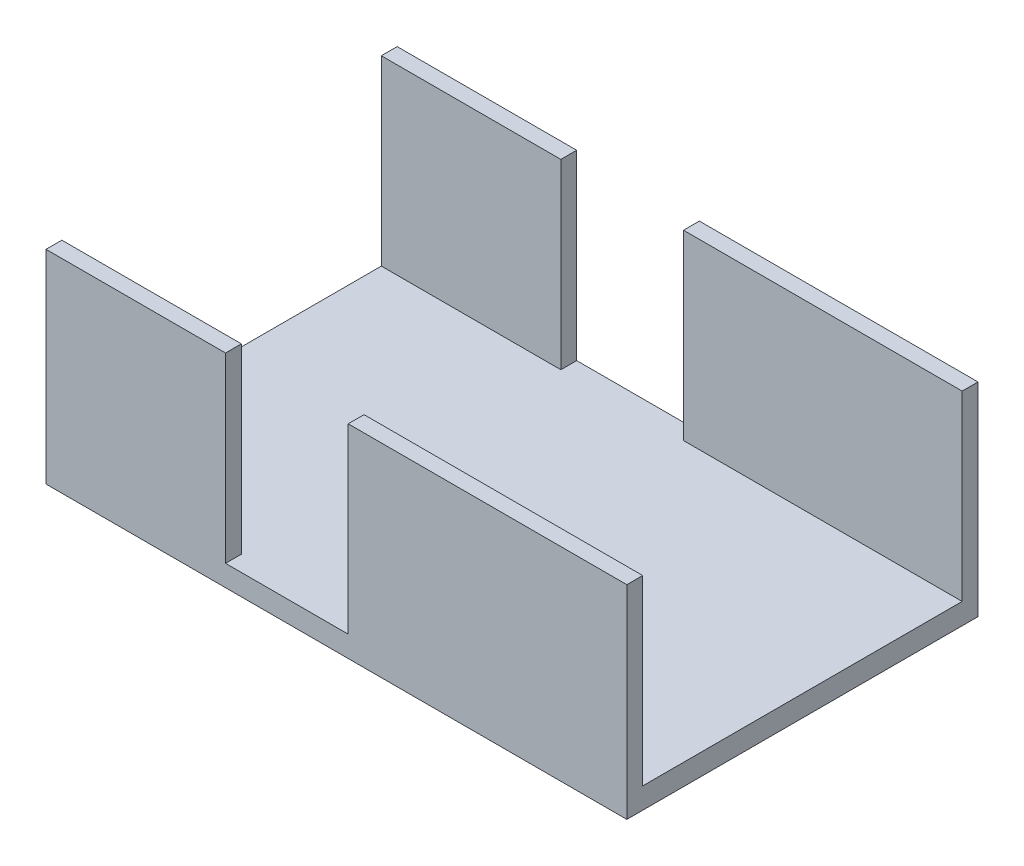
ISO-10303-21;
HEADER;
FILE_DESCRIPTION(('STEP AP214'),'2;1');
FILE_NAME('part.step','',(''),(''),'','','');
FILE_SCHEMA(('AUTOMOTIVE_DESIGN { 1 0 10303 214 1 1 1 1 }'));
ENDSEC;
DATA;
#1=APPLICATION_CONTEXT('core data for automotive mechanical design processes');
#2=APPLICATION_PROTOCOL_DEFINITION('international standard','automotive_design',2000,#1);
#3=PRODUCT_CONTEXT('',#1,'mechanical');
#4=PRODUCT('Part','Part','',(#3));
#5=PRODUCT_RELATED_PRODUCT_CATEGORY('part','',(#4));
#6=PRODUCT_DEFINITION_FORMATION('','',#4);
#7=PRODUCT_DEFINITION_CONTEXT('part definition',#1,'design');
#8=PRODUCT_DEFINITION('design','',#6,#7);
#9=PRODUCT_DEFINITION_SHAPE('','',#8);
#10=(LENGTH_UNIT() NAMED_UNIT(*) SI_UNIT(.MILLI.,.METRE.));
#11=(NAMED_UNIT(*) PLANE_ANGLE_UNIT() SI_UNIT($,.RADIAN.));
#12=(NAMED_UNIT(*) SI_UNIT($,.STERADIAN.) SOLID_ANGLE_UNIT());
#13=UNCERTAINTY_MEASURE_WITH_UNIT(LENGTH_MEASURE(1.E-05),#10,'distance_accuracy_value','');
#14=(GEOMETRIC_REPRESENTATION_CONTEXT(3) GLOBAL_UNCERTAINTY_ASSIGNED_CONTEXT((#13)) GLOBAL_UNIT_ASSIGNED_CONTEXT((#10,
#11,#12)) REPRESENTATION_CONTEXT('',''));
#15=CARTESIAN_POINT('',(0.,0.,0.));
#16=DIRECTION('',(0.,0.,1.));
#17=DIRECTION('',(1.,0.,0.));
#18=AXIS2_PLACEMENT_3D('',#15,#16,#17);
#19=CARTESIAN_POINT('',(110.,4.,0.));
#20=DIRECTION('',(-1.,0.,0.));
#21=DIRECTION('',(0.,0.,1.));
#22=AXIS2_PLACEMENT_3D('',#19,#20,#21);
#23=PLANE('',#22);
#24=DIRECTION('',(0.,0.,-1.));
#25=VECTOR('',#24,1.);
#26=CARTESIAN_POINT('',(110.,0.,0.));
#27=LINE('',#26,#25);
#28=CARTESIAN_POINT('',(110.,0.,0.));
#29=VERTEX_POINT('',#28);
#30=CARTESIAN_POINT('',(110.,0.,-66.5));
#31=VERTEX_POINT('',#30);
#32=EDGE_CURVE('E252',#29,#31,#27,.T.);
#33=ORIENTED_EDGE('',*,*,#32,.T.);
#34=DIRECTION('',(0.,-1.,0.));
#35=VECTOR('',#34,1.);
#36=CARTESIAN_POINT('',(110.,38.5,-66.5));
#37=LINE('',#36,#35);
#38=CARTESIAN_POINT('',(110.,38.5,-66.5));
#39=VERTEX_POINT('',#38);
#40=EDGE_CURVE('E240',#39,#31,#37,.T.);
#41=ORIENTED_EDGE('',*,*,#40,.F.);
#42=DIRECTION('',(0.,0.,-1.));
#43=VECTOR('',#42,1.);
#44=CARTESIAN_POINT('',(110.,38.5,0.));
#45=LINE('',#44,#43);
#46=CARTESIAN_POINT('',(110.,38.5,-63.5));
#47=VERTEX_POINT('',#46);
#48=EDGE_CURVE('E238',#47,#39,#45,.T.);
#49=ORIENTED_EDGE('',*,*,#48,.F.);
#50=DIRECTION('',(0.,-1.,0.));
#51=VECTOR('',#50,1.);
#52=CARTESIAN_POINT('',(110.,38.5,-63.5));
#53=LINE('',#52,#51);
#54=CARTESIAN_POINT('',(110.,4.,-63.5));
#55=VERTEX_POINT('',#54);
#56=EDGE_CURVE('E243',#47,#55,#53,.T.);
#57=ORIENTED_EDGE('',*,*,#56,.T.);
#58=DIRECTION('',(0.,0.,-1.));
#59=VECTOR('',#58,1.);
#60=CARTESIAN_POINT('',(110.,4.,0.));
#61=LINE('',#60,#59);
#62=CARTESIAN_POINT('',(110.,4.,-3.));
#63=VERTEX_POINT('',#62);
#64=EDGE_CURVE('E258',#63,#55,#61,.T.);
#65=ORIENTED_EDGE('',*,*,#64,.F.);
#66=DIRECTION('',(0.,-1.,0.));
#67=VECTOR('',#66,1.);
#68=CARTESIAN_POINT('',(110.,38.5,-3.));
#69=LINE('',#68,#67);
#70=CARTESIAN_POINT('',(110.,38.5,-3.));
#71=VERTEX_POINT('',#70);
#72=EDGE_CURVE('E221',#71,#63,#69,.T.);
#73=ORIENTED_EDGE('',*,*,#72,.F.);
#74=DIRECTION('',(0.,0.,-1.));
#75=VECTOR('',#74,1.);
#76=CARTESIAN_POINT('',(110.,38.5,0.));
#77=LINE('',#76,#75);
#78=CARTESIAN_POINT('',(110.,38.5,0.));
#79=VERTEX_POINT('',#78);
#80=EDGE_CURVE('E219',#79,#71,#77,.T.);
#81=ORIENTED_EDGE('',*,*,#80,.F.);
#82=DIRECTION('',(0.,-1.,0.));
#83=VECTOR('',#82,1.);
#84=CARTESIAN_POINT('',(110.,38.5,0.));
#85=LINE('',#84,#83);
#86=EDGE_CURVE('E223',#79,#29,#85,.T.);
#87=ORIENTED_EDGE('',*,*,#86,.T.);
#88=EDGE_LOOP('',(#33,#41,#49,#57,#65,#73,#81,#87));
#89=FACE_BOUND('',#88,.T.);
#90=ADVANCED_FACE('F41',(#89),#23,.F.);
#91=CARTESIAN_POINT('',(0.,4.,-66.5));
#92=DIRECTION('',(0.,0.,-1.));
#93=DIRECTION('',(-1.,0.,0.));
#94=AXIS2_PLACEMENT_3D('',#91,#92,#93);
#95=PLANE('',#94);
#96=DIRECTION('',(1.,0.,0.));
#97=VECTOR('',#96,1.);
#98=CARTESIAN_POINT('',(0.,0.,-66.5));
#99=LINE('',#98,#97);
#100=CARTESIAN_POINT('',(0.,0.,-66.5));
#101=VERTEX_POINT('',#100);
#102=EDGE_CURVE('E278',#101,#31,#99,.T.);
#103=ORIENTED_EDGE('',*,*,#102,.F.);
#104=DIRECTION('',(0.,-1.,0.));
#105=VECTOR('',#104,1.);
#106=CARTESIAN_POINT('',(0.,38.5,-66.5));
#107=LINE('',#106,#105);
#108=CARTESIAN_POINT('',(0.,38.5,-66.5));
#109=VERTEX_POINT('',#108);
#110=EDGE_CURVE('E185',#109,#101,#107,.T.);
#111=ORIENTED_EDGE('',*,*,#110,.F.);
#112=DIRECTION('',(1.,0.,0.));
#113=VECTOR('',#112,1.);
#114=CARTESIAN_POINT('',(0.,38.5,-66.5));
#115=LINE('',#114,#113);
#116=CARTESIAN_POINT('',(34.,38.5,-66.5));
#117=VERTEX_POINT('',#116);
#118=EDGE_CURVE('E178',#109,#117,#115,.T.);
#119=ORIENTED_EDGE('',*,*,#118,.T.);
#120=DIRECTION('',(0.,-1.,0.));
#121=VECTOR('',#120,1.);
#122=CARTESIAN_POINT('',(34.,38.5,-66.5));
#123=LINE('',#122,#121);
#124=CARTESIAN_POINT('',(34.,4.,-66.5));
#125=VERTEX_POINT('',#124);
#126=EDGE_CURVE('E164',#117,#125,#123,.T.);
#127=ORIENTED_EDGE('',*,*,#126,.T.);
#128=DIRECTION('',(1.,0.,0.));
#129=VECTOR('',#128,1.);
#130=CARTESIAN_POINT('',(0.,4.,-66.5));
#131=LINE('',#130,#129);
#132=CARTESIAN_POINT('',(57.23,4.,-66.5));
#133=VERTEX_POINT('',#132);
#134=EDGE_CURVE('E265',#125,#133,#131,.T.);
#135=ORIENTED_EDGE('',*,*,#134,.T.);
#136=DIRECTION('',(0.,-1.,0.));
#137=VECTOR('',#136,1.);
#138=CARTESIAN_POINT('',(57.23,38.5,-66.5));
#139=LINE('',#138,#137);
#140=CARTESIAN_POINT('',(57.23,38.5,-66.5));
#141=VERTEX_POINT('',#140);
#142=EDGE_CURVE('E249',#141,#133,#139,.T.);
#143=ORIENTED_EDGE('',*,*,#142,.F.);
#144=DIRECTION('',(1.,0.,0.));
#145=VECTOR('',#144,1.);
#146=CARTESIAN_POINT('',(0.,38.5,-66.5));
#147=LINE('',#146,#145);
#148=EDGE_CURVE('E163',#141,#39,#147,.T.);
#149=ORIENTED_EDGE('',*,*,#148,.T.);
#150=ORIENTED_EDGE('',*,*,#40,.T.);
#151=EDGE_LOOP('',(#103,#111,#119,#127,#135,#143,#149,#150));
#152=FACE_BOUND('',#151,.T.);
#153=ADVANCED_FACE('F319',(#152),#95,.T.);
#154=CARTESIAN_POINT('',(0.,4.,0.));
#155=DIRECTION('',(-1.,0.,0.));
#156=DIRECTION('',(0.,0.,1.));
#157=AXIS2_PLACEMENT_3D('',#154,#155,#156);
#158=PLANE('',#157);
#159=DIRECTION('',(0.,0.,-1.));
#160=VECTOR('',#159,1.);
#161=CARTESIAN_POINT('',(0.,0.,0.));
#162=LINE('',#161,#160);
#163=CARTESIAN_POINT('',(0.,0.,0.));
#164=VERTEX_POINT('',#163);
#165=EDGE_CURVE('E279',#164,#101,#162,.T.);
#166=ORIENTED_EDGE('',*,*,#165,.F.);
#167=DIRECTION('',(0.,-1.,0.));
#168=VECTOR('',#167,1.);
#169=CARTESIAN_POINT('',(0.,38.5,0.));
#170=LINE('',#169,#168);
#171=CARTESIAN_POINT('',(0.,38.5,0.));
#172=VERTEX_POINT('',#171);
#173=EDGE_CURVE('E204',#172,#164,#170,.T.);
#174=ORIENTED_EDGE('',*,*,#173,.F.);
#175=DIRECTION('',(0.,0.,-1.));
#176=VECTOR('',#175,1.);
#177=CARTESIAN_POINT('',(0.,38.5,0.));
#178=LINE('',#177,#176);
#179=CARTESIAN_POINT('',(0.,38.5,-3.));
#180=VERTEX_POINT('',#179);
#181=EDGE_CURVE('E196',#172,#180,#178,.T.);
#182=ORIENTED_EDGE('',*,*,#181,.T.);
#183=DIRECTION('',(0.,-1.,0.));
#184=VECTOR('',#183,1.);
#185=CARTESIAN_POINT('',(0.,38.5,-3.));
#186=LINE('',#185,#184);
#187=CARTESIAN_POINT('',(0.,4.,-3.));
#188=VERTEX_POINT('',#187);
#189=EDGE_CURVE('E207',#180,#188,#186,.T.);
#190=ORIENTED_EDGE('',*,*,#189,.T.);
#191=DIRECTION('',(0.,0.,-1.));
#192=VECTOR('',#191,1.);
#193=CARTESIAN_POINT('',(0.,4.,0.));
#194=LINE('',#193,#192);
#195=CARTESIAN_POINT('',(0.,4.,-63.5));
#196=VERTEX_POINT('',#195);
#197=EDGE_CURVE('E271',#188,#196,#194,.T.);
#198=ORIENTED_EDGE('',*,*,#197,.T.);
#199=DIRECTION('',(0.,-1.,0.));
#200=VECTOR('',#199,1.);
#201=CARTESIAN_POINT('',(0.,38.5,-63.5));
#202=LINE('',#201,#200);
#203=CARTESIAN_POINT('',(0.,38.5,-63.5));
#204=VERTEX_POINT('',#203);
#205=EDGE_CURVE('E183',#204,#196,#202,.T.);
#206=ORIENTED_EDGE('',*,*,#205,.F.);
#207=DIRECTION('',(0.,0.,-1.));
#208=VECTOR('',#207,1.);
#209=CARTESIAN_POINT('',(0.,38.5,0.));
#210=LINE('',#209,#208);
#211=EDGE_CURVE('E173',#204,#109,#210,.T.);
#212=ORIENTED_EDGE('',*,*,#211,.T.);
#213=ORIENTED_EDGE('',*,*,#110,.T.);
#214=EDGE_LOOP('',(#166,#174,#182,#190,#198,#206,#212,#213));
#215=FACE_BOUND('',#214,.T.);
#216=ADVANCED_FACE('F323',(#215),#158,.T.);
#217=CARTESIAN_POINT('',(0.,4.,0.));
#218=DIRECTION('',(0.,0.,-1.));
#219=DIRECTION('',(-1.,0.,0.));
#220=AXIS2_PLACEMENT_3D('',#217,#218,#219);
#221=PLANE('',#220);
#222=DIRECTION('',(1.,0.,0.));
#223=VECTOR('',#222,1.);
#224=CARTESIAN_POINT('',(0.,0.,0.));
#225=LINE('',#224,#223);
#226=EDGE_CURVE('E44',#164,#29,#225,.T.);
#227=ORIENTED_EDGE('',*,*,#226,.T.);
#228=ORIENTED_EDGE('',*,*,#86,.F.);
#229=DIRECTION('',(1.,0.,0.));
#230=VECTOR('',#229,1.);
#231=CARTESIAN_POINT('',(0.,38.5,0.));
#232=LINE('',#231,#230);
#233=CARTESIAN_POINT('',(57.23,38.5,0.));
#234=VERTEX_POINT('',#233);
#235=EDGE_CURVE('E217',#234,#79,#232,.T.);
#236=ORIENTED_EDGE('',*,*,#235,.F.);
#237=DIRECTION('',(0.,-1.,0.));
#238=VECTOR('',#237,1.);
#239=CARTESIAN_POINT('',(57.23,38.5,0.));
#240=LINE('',#239,#238);
#241=CARTESIAN_POINT('',(57.23,4.,0.));
#242=VERTEX_POINT('',#241);
#243=EDGE_CURVE('E226',#234,#242,#240,.T.);
#244=ORIENTED_EDGE('',*,*,#243,.T.);
#245=DIRECTION('',(1.,0.,0.));
#246=VECTOR('',#245,1.);
#247=CARTESIAN_POINT('',(0.,4.,0.));
#248=LINE('',#247,#246);
#249=CARTESIAN_POINT('',(34.,4.,0.));
#250=VERTEX_POINT('',#249);
#251=EDGE_CURVE('E11',#250,#242,#248,.T.);
#252=ORIENTED_EDGE('',*,*,#251,.F.);
#253=DIRECTION('',(0.,-1.,0.));
#254=VECTOR('',#253,1.);
#255=CARTESIAN_POINT('',(34.,38.5,0.));
#256=LINE('',#255,#254);
#257=CARTESIAN_POINT('',(34.,38.5,0.));
#258=VERTEX_POINT('',#257);
#259=EDGE_CURVE('E201',#258,#250,#256,.T.);
#260=ORIENTED_EDGE('',*,*,#259,.F.);
#261=DIRECTION('',(1.,0.,0.));
#262=VECTOR('',#261,1.);
#263=CARTESIAN_POINT('',(0.,38.5,0.));
#264=LINE('',#263,#262);
#265=EDGE_CURVE('E199',#172,#258,#264,.T.);
#266=ORIENTED_EDGE('',*,*,#265,.F.);
#267=ORIENTED_EDGE('',*,*,#173,.T.);
#268=EDGE_LOOP('',(#227,#228,#236,#244,#252,#260,#266,#267));
#269=FACE_BOUND('',#268,.T.);
#270=ADVANCED_FACE('F286',(#269),#221,.F.);
#271=CARTESIAN_POINT('',(0.,4.,0.));
#272=DIRECTION('',(0.,1.,0.));
#273=DIRECTION('',(0.,0.,1.));
#274=AXIS2_PLACEMENT_3D('',#271,#272,#273);
#275=PLANE('',#274);
#276=DIRECTION('',(0.,0.,1.));
#277=VECTOR('',#276,1.);
#278=CARTESIAN_POINT('',(57.23,4.,0.));
#279=LINE('',#278,#277);
#280=CARTESIAN_POINT('',(57.23,4.,-3.));
#281=VERTEX_POINT('',#280);
#282=EDGE_CURVE('E253',#281,#242,#279,.T.);
#283=ORIENTED_EDGE('',*,*,#282,.F.);
#284=DIRECTION('',(1.,0.,0.));
#285=VECTOR('',#284,1.);
#286=CARTESIAN_POINT('',(0.,4.,-3.));
#287=LINE('',#286,#285);
#288=EDGE_CURVE('E255',#281,#63,#287,.T.);
#289=ORIENTED_EDGE('',*,*,#288,.T.);
#290=ORIENTED_EDGE('',*,*,#64,.T.);
#291=DIRECTION('',(-1.,0.,0.));
#292=VECTOR('',#291,1.);
#293=CARTESIAN_POINT('',(0.,4.,-63.5));
#294=LINE('',#293,#292);
#295=CARTESIAN_POINT('',(57.23,4.,-63.5));
#296=VERTEX_POINT('',#295);
#297=EDGE_CURVE('E260',#55,#296,#294,.T.);
#298=ORIENTED_EDGE('',*,*,#297,.T.);
#299=DIRECTION('',(0.,0.,1.));
#300=VECTOR('',#299,1.);
#301=CARTESIAN_POINT('',(57.23,4.,0.));
#302=LINE('',#301,#300);
#303=EDGE_CURVE('E262',#133,#296,#302,.T.);
#304=ORIENTED_EDGE('',*,*,#303,.F.);
#305=ORIENTED_EDGE('',*,*,#134,.F.);
#306=DIRECTION('',(0.,0.,1.));
#307=VECTOR('',#306,1.);
#308=CARTESIAN_POINT('',(34.,4.,0.));
#309=LINE('',#308,#307);
#310=CARTESIAN_POINT('',(34.,4.,-63.5));
#311=VERTEX_POINT('',#310);
#312=EDGE_CURVE('E268',#125,#311,#309,.T.);
#313=ORIENTED_EDGE('',*,*,#312,.T.);
#314=DIRECTION('',(-1.,0.,0.));
#315=VECTOR('',#314,1.);
#316=CARTESIAN_POINT('',(0.,4.,-63.5));
#317=LINE('',#316,#315);
#318=EDGE_CURVE('E159',#311,#196,#317,.T.);
#319=ORIENTED_EDGE('',*,*,#318,.T.);
#320=ORIENTED_EDGE('',*,*,#197,.F.);
#321=DIRECTION('',(1.,0.,0.));
#322=VECTOR('',#321,1.);
#323=CARTESIAN_POINT('',(0.,4.,-3.));
#324=LINE('',#323,#322);
#325=CARTESIAN_POINT('',(34.,4.,-3.));
#326=VERTEX_POINT('',#325);
#327=EDGE_CURVE('E60',#188,#326,#324,.T.);
#328=ORIENTED_EDGE('',*,*,#327,.T.);
#329=DIRECTION('',(0.,0.,1.));
#330=VECTOR('',#329,1.);
#331=CARTESIAN_POINT('',(34.,4.,0.));
#332=LINE('',#331,#330);
#333=EDGE_CURVE('E49',#326,#250,#332,.T.);
#334=ORIENTED_EDGE('',*,*,#333,.T.);
#335=ORIENTED_EDGE('',*,*,#251,.T.);
#336=EDGE_LOOP('',(#283,#289,#290,#298,#304,#305,#313,#319,#320,#328,#334,#335));
#337=FACE_BOUND('',#336,.T.);
#338=ADVANCED_FACE('F302',(#337),#275,.T.);
#339=CARTESIAN_POINT('',(0.,0.,0.));
#340=DIRECTION('',(0.,1.,0.));
#341=DIRECTION('',(0.,0.,1.));
#342=AXIS2_PLACEMENT_3D('',#339,#340,#341);
#343=PLANE('',#342);
#344=ORIENTED_EDGE('',*,*,#32,.F.);
#345=ORIENTED_EDGE('',*,*,#226,.F.);
#346=ORIENTED_EDGE('',*,*,#165,.T.);
#347=ORIENTED_EDGE('',*,*,#102,.T.);
#348=EDGE_LOOP('',(#344,#345,#346,#347));
#349=FACE_BOUND('',#348,.T.);
#350=ADVANCED_FACE('F333',(#349),#343,.F.);
#351=CARTESIAN_POINT('',(57.23,38.5,0.));
#352=DIRECTION('',(1.,0.,0.));
#353=DIRECTION('',(0.,0.,-1.));
#354=AXIS2_PLACEMENT_3D('',#351,#352,#353);
#355=PLANE('',#354);
#356=ORIENTED_EDGE('',*,*,#303,.T.);
#357=DIRECTION('',(0.,-1.,0.));
#358=VECTOR('',#357,1.);
#359=CARTESIAN_POINT('',(57.23,38.5,-63.5));
#360=LINE('',#359,#358);
#361=CARTESIAN_POINT('',(57.23,38.5,-63.5));
#362=VERTEX_POINT('',#361);
#363=EDGE_CURVE('E246',#362,#296,#360,.T.);
#364=ORIENTED_EDGE('',*,*,#363,.F.);
#365=DIRECTION('',(0.,0.,1.));
#366=VECTOR('',#365,1.);
#367=CARTESIAN_POINT('',(57.23,38.5,0.));
#368=LINE('',#367,#366);
#369=EDGE_CURVE('E233',#141,#362,#368,.T.);
#370=ORIENTED_EDGE('',*,*,#369,.F.);
#371=ORIENTED_EDGE('',*,*,#142,.T.);
#372=EDGE_LOOP('',(#356,#364,#370,#371));
#373=FACE_BOUND('',#372,.T.);
#374=ADVANCED_FACE('F336',(#373),#355,.F.);
#375=CARTESIAN_POINT('',(0.,38.5,-63.5));
#376=DIRECTION('',(0.,0.,1.));
#377=DIRECTION('',(1.,0.,0.));
#378=AXIS2_PLACEMENT_3D('',#375,#376,#377);
#379=PLANE('',#378);
#380=ORIENTED_EDGE('',*,*,#363,.T.);
#381=ORIENTED_EDGE('',*,*,#297,.F.);
#382=ORIENTED_EDGE('',*,*,#56,.F.);
#383=DIRECTION('',(-1.,0.,0.));
#384=VECTOR('',#383,1.);
#385=CARTESIAN_POINT('',(0.,38.5,-63.5));
#386=LINE('',#385,#384);
#387=EDGE_CURVE('E235',#47,#362,#386,.T.);
#388=ORIENTED_EDGE('',*,*,#387,.T.);
#389=EDGE_LOOP('',(#380,#381,#382,#388));
#390=FACE_BOUND('',#389,.T.);
#391=ADVANCED_FACE('F341',(#390),#379,.T.);
#392=CARTESIAN_POINT('',(0.,38.5,0.));
#393=DIRECTION('',(0.,1.,0.));
#394=DIRECTION('',(0.,0.,1.));
#395=AXIS2_PLACEMENT_3D('',#392,#393,#394);
#396=PLANE('',#395);
#397=ORIENTED_EDGE('',*,*,#148,.F.);
#398=ORIENTED_EDGE('',*,*,#369,.T.);
#399=ORIENTED_EDGE('',*,*,#387,.F.);
#400=ORIENTED_EDGE('',*,*,#48,.T.);
#401=EDGE_LOOP('',(#397,#398,#399,#400));
#402=FACE_BOUND('',#401,.T.);
#403=ADVANCED_FACE('F344',(#402),#396,.T.);
#404=CARTESIAN_POINT('',(0.,38.5,-63.5));
#405=DIRECTION('',(0.,0.,1.));
#406=DIRECTION('',(1.,0.,0.));
#407=AXIS2_PLACEMENT_3D('',#404,#405,#406);
#408=PLANE('',#407);
#409=ORIENTED_EDGE('',*,*,#205,.T.);
#410=ORIENTED_EDGE('',*,*,#318,.F.);
#411=DIRECTION('',(0.,-1.,0.));
#412=VECTOR('',#411,1.);
#413=CARTESIAN_POINT('',(34.,38.5,-63.5));
#414=LINE('',#413,#412);
#415=CARTESIAN_POINT('',(34.,38.5,-63.5));
#416=VERTEX_POINT('',#415);
#417=EDGE_CURVE('E153',#416,#311,#414,.T.);
#418=ORIENTED_EDGE('',*,*,#417,.F.);
#419=DIRECTION('',(-1.,0.,0.));
#420=VECTOR('',#419,1.);
#421=CARTESIAN_POINT('',(0.,38.5,-63.5));
#422=LINE('',#421,#420);
#423=EDGE_CURVE('E157',#416,#204,#422,.T.);
#424=ORIENTED_EDGE('',*,*,#423,.T.);
#425=EDGE_LOOP('',(#409,#410,#418,#424));
#426=FACE_BOUND('',#425,.T.);
#427=ADVANCED_FACE('F156',(#426),#408,.T.);
#428=CARTESIAN_POINT('',(34.,38.5,0.));
#429=DIRECTION('',(1.,0.,0.));
#430=DIRECTION('',(0.,0.,-1.));
#431=AXIS2_PLACEMENT_3D('',#428,#429,#430);
#432=PLANE('',#431);
#433=ORIENTED_EDGE('',*,*,#417,.T.);
#434=ORIENTED_EDGE('',*,*,#312,.F.);
#435=ORIENTED_EDGE('',*,*,#126,.F.);
#436=DIRECTION('',(0.,0.,1.));
#437=VECTOR('',#436,1.);
#438=CARTESIAN_POINT('',(34.,38.5,0.));
#439=LINE('',#438,#437);
#440=EDGE_CURVE('E170',#117,#416,#439,.T.);
#441=ORIENTED_EDGE('',*,*,#440,.T.);
#442=EDGE_LOOP('',(#433,#434,#435,#441));
#443=FACE_BOUND('',#442,.T.);
#444=ADVANCED_FACE('F176',(#443),#432,.T.);
#445=CARTESIAN_POINT('',(0.,38.5,0.));
#446=DIRECTION('',(0.,1.,0.));
#447=DIRECTION('',(0.,0.,1.));
#448=AXIS2_PLACEMENT_3D('',#445,#446,#447);
#449=PLANE('',#448);
#450=ORIENTED_EDGE('',*,*,#423,.F.);
#451=ORIENTED_EDGE('',*,*,#440,.F.);
#452=ORIENTED_EDGE('',*,*,#118,.F.);
#453=ORIENTED_EDGE('',*,*,#211,.F.);
#454=EDGE_LOOP('',(#450,#451,#452,#453));
#455=FACE_BOUND('',#454,.T.);
#456=ADVANCED_FACE('F168',(#455),#449,.T.);
#457=CARTESIAN_POINT('',(34.,38.5,0.));
#458=DIRECTION('',(1.,0.,0.));
#459=DIRECTION('',(0.,0.,-1.));
#460=AXIS2_PLACEMENT_3D('',#457,#458,#459);
#461=PLANE('',#460);
#462=ORIENTED_EDGE('',*,*,#259,.T.);
#463=ORIENTED_EDGE('',*,*,#333,.F.);
#464=DIRECTION('',(0.,-1.,0.));
#465=VECTOR('',#464,1.);
#466=CARTESIAN_POINT('',(34.,38.5,-3.));
#467=LINE('',#466,#465);
#468=CARTESIAN_POINT('',(34.,38.5,-3.));
#469=VERTEX_POINT('',#468);
#470=EDGE_CURVE('E174',#469,#326,#467,.T.);
#471=ORIENTED_EDGE('',*,*,#470,.F.);
#472=DIRECTION('',(0.,0.,1.));
#473=VECTOR('',#472,1.);
#474=CARTESIAN_POINT('',(34.,38.5,0.));
#475=LINE('',#474,#473);
#476=EDGE_CURVE('E189',#469,#258,#475,.T.);
#477=ORIENTED_EDGE('',*,*,#476,.T.);
#478=EDGE_LOOP('',(#462,#463,#471,#477));
#479=FACE_BOUND('',#478,.T.);
#480=ADVANCED_FACE('F362',(#479),#461,.T.);
#481=CARTESIAN_POINT('',(0.,38.5,-3.));
#482=DIRECTION('',(0.,0.,-1.));
#483=DIRECTION('',(-1.,0.,0.));
#484=AXIS2_PLACEMENT_3D('',#481,#482,#483);
#485=PLANE('',#484);
#486=ORIENTED_EDGE('',*,*,#470,.T.);
#487=ORIENTED_EDGE('',*,*,#327,.F.);
#488=ORIENTED_EDGE('',*,*,#189,.F.);
#489=DIRECTION('',(1.,0.,0.));
#490=VECTOR('',#489,1.);
#491=CARTESIAN_POINT('',(0.,38.5,-3.));
#492=LINE('',#491,#490);
#493=EDGE_CURVE('E192',#180,#469,#492,.T.);
#494=ORIENTED_EDGE('',*,*,#493,.T.);
#495=EDGE_LOOP('',(#486,#487,#488,#494));
#496=FACE_BOUND('',#495,.T.);
#497=ADVANCED_FACE('F314',(#496),#485,.T.);
#498=CARTESIAN_POINT('',(0.,38.5,0.));
#499=DIRECTION('',(0.,1.,0.));
#500=DIRECTION('',(0.,0.,1.));
#501=AXIS2_PLACEMENT_3D('',#498,#499,#500);
#502=PLANE('',#501);
#503=ORIENTED_EDGE('',*,*,#476,.F.);
#504=ORIENTED_EDGE('',*,*,#493,.F.);
#505=ORIENTED_EDGE('',*,*,#181,.F.);
#506=ORIENTED_EDGE('',*,*,#265,.T.);
#507=EDGE_LOOP('',(#503,#504,#505,#506));
#508=FACE_BOUND('',#507,.T.);
#509=ADVANCED_FACE('F307',(#508),#502,.T.);
#510=CARTESIAN_POINT('',(0.,38.5,-3.));
#511=DIRECTION('',(0.,0.,-1.));
#512=DIRECTION('',(-1.,0.,0.));
#513=AXIS2_PLACEMENT_3D('',#510,#511,#512);
#514=PLANE('',#513);
#515=ORIENTED_EDGE('',*,*,#72,.T.);
#516=ORIENTED_EDGE('',*,*,#288,.F.);
#517=DIRECTION('',(0.,-1.,0.));
#518=VECTOR('',#517,1.);
#519=CARTESIAN_POINT('',(57.23,38.5,-3.));
#520=LINE('',#519,#518);
#521=CARTESIAN_POINT('',(57.23,38.5,-3.));
#522=VERTEX_POINT('',#521);
#523=EDGE_CURVE('E193',#522,#281,#520,.T.);
#524=ORIENTED_EDGE('',*,*,#523,.F.);
#525=DIRECTION('',(1.,0.,0.));
#526=VECTOR('',#525,1.);
#527=CARTESIAN_POINT('',(0.,38.5,-3.));
#528=LINE('',#527,#526);
#529=EDGE_CURVE('E212',#522,#71,#528,.T.);
#530=ORIENTED_EDGE('',*,*,#529,.T.);
#531=EDGE_LOOP('',(#515,#516,#524,#530));
#532=FACE_BOUND('',#531,.T.);
#533=ADVANCED_FACE('F305',(#532),#514,.T.);
#534=CARTESIAN_POINT('',(57.23,38.5,0.));
#535=DIRECTION('',(1.,0.,0.));
#536=DIRECTION('',(0.,0.,-1.));
#537=AXIS2_PLACEMENT_3D('',#534,#535,#536);
#538=PLANE('',#537);
#539=ORIENTED_EDGE('',*,*,#282,.T.);
#540=ORIENTED_EDGE('',*,*,#243,.F.);
#541=DIRECTION('',(0.,0.,1.));
#542=VECTOR('',#541,1.);
#543=CARTESIAN_POINT('',(57.23,38.5,0.));
#544=LINE('',#543,#542);
#545=EDGE_CURVE('E215',#522,#234,#544,.T.);
#546=ORIENTED_EDGE('',*,*,#545,.F.);
#547=ORIENTED_EDGE('',*,*,#523,.T.);
#548=EDGE_LOOP('',(#539,#540,#546,#547));
#549=FACE_BOUND('',#548,.T.);
#550=ADVANCED_FACE('F303',(#549),#538,.F.);
#551=CARTESIAN_POINT('',(0.,38.5,0.));
#552=DIRECTION('',(0.,1.,0.));
#553=DIRECTION('',(0.,0.,1.));
#554=AXIS2_PLACEMENT_3D('',#551,#552,#553);
#555=PLANE('',#554);
#556=ORIENTED_EDGE('',*,*,#529,.F.);
#557=ORIENTED_EDGE('',*,*,#545,.T.);
#558=ORIENTED_EDGE('',*,*,#235,.T.);
#559=ORIENTED_EDGE('',*,*,#80,.T.);
#560=EDGE_LOOP('',(#556,#557,#558,#559));
#561=FACE_BOUND('',#560,.T.);
#562=ADVANCED_FACE('F296',(#561),#555,.T.);
#563=CLOSED_SHELL('',(#90,#153,#216,#270,#338,#350,#374,#391,#403,#427,#444,#456,#480,#497,#509,
#533,#550,#562));
#564=MANIFOLD_SOLID_BREP('B2',#563);
#565=ADVANCED_BREP_SHAPE_REPRESENTATION('',(#18,#564),#14);
#566=SHAPE_DEFINITION_REPRESENTATION(#9,#565);
ENDSEC;
END-ISO-10303-21;
